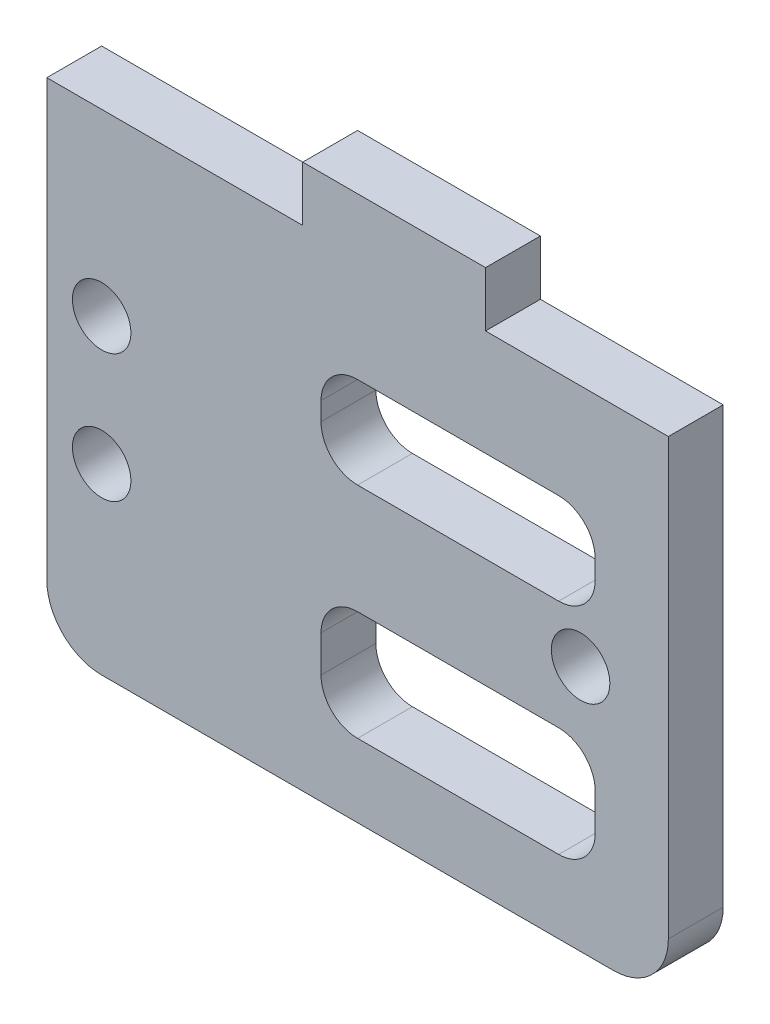
ISO-10303-21;
HEADER;
FILE_DESCRIPTION(('STEP AP214'),'2;1');
FILE_NAME('part.step','',(''),(''),'','','');
FILE_SCHEMA(('AUTOMOTIVE_DESIGN { 1 0 10303 214 1 1 1 1 }'));
ENDSEC;
DATA;
#1=APPLICATION_CONTEXT('core data for automotive mechanical design processes');
#2=APPLICATION_PROTOCOL_DEFINITION('international standard','automotive_design',2000,#1);
#3=PRODUCT_CONTEXT('',#1,'mechanical');
#4=PRODUCT('Part','Part','',(#3));
#5=PRODUCT_RELATED_PRODUCT_CATEGORY('part','',(#4));
#6=PRODUCT_DEFINITION_FORMATION('','',#4);
#7=PRODUCT_DEFINITION_CONTEXT('part definition',#1,'design');
#8=PRODUCT_DEFINITION('design','',#6,#7);
#9=PRODUCT_DEFINITION_SHAPE('','',#8);
#10=(LENGTH_UNIT() NAMED_UNIT(*) SI_UNIT(.MILLI.,.METRE.));
#11=(NAMED_UNIT(*) PLANE_ANGLE_UNIT() SI_UNIT($,.RADIAN.));
#12=(NAMED_UNIT(*) SI_UNIT($,.STERADIAN.) SOLID_ANGLE_UNIT());
#13=UNCERTAINTY_MEASURE_WITH_UNIT(LENGTH_MEASURE(1.E-05),#10,'distance_accuracy_value','');
#14=(GEOMETRIC_REPRESENTATION_CONTEXT(3) GLOBAL_UNCERTAINTY_ASSIGNED_CONTEXT((#13)) GLOBAL_UNIT_ASSIGNED_CONTEXT((#10,
#11,#12)) REPRESENTATION_CONTEXT('',''));
#15=CARTESIAN_POINT('',(0.,0.,0.));
#16=DIRECTION('',(0.,0.,1.));
#17=DIRECTION('',(1.,0.,0.));
#18=AXIS2_PLACEMENT_3D('',#15,#16,#17);
#19=CARTESIAN_POINT('',(0.,0.,3.));
#20=DIRECTION('',(0.,0.,-1.));
#21=DIRECTION('',(-1.,0.,0.));
#22=AXIS2_PLACEMENT_3D('',#19,#20,#21);
#23=PLANE('',#22);
#24=DIRECTION('',(0.,-1.,0.));
#25=VECTOR('',#24,1.);
#26=CARTESIAN_POINT('',(15.,10.,3.));
#27=LINE('',#26,#25);
#28=CARTESIAN_POINT('',(15.,8.,3.));
#29=VERTEX_POINT('',#28);
#30=CARTESIAN_POINT('',(15.,6.,3.));
#31=VERTEX_POINT('',#30);
#32=EDGE_CURVE('E475',#29,#31,#27,.T.);
#33=ORIENTED_EDGE('',*,*,#32,.F.);
#34=CARTESIAN_POINT('',(17.,8.,3.));
#35=DIRECTION('',(0.,0.,-1.));
#36=DIRECTION('',(-1.,0.,0.));
#37=AXIS2_PLACEMENT_3D('',#34,#35,#36);
#38=CIRCLE('',#37,2.);
#39=CARTESIAN_POINT('',(17.,10.,3.));
#40=VERTEX_POINT('',#39);
#41=EDGE_CURVE('E344',#29,#40,#38,.T.);
#42=ORIENTED_EDGE('',*,*,#41,.T.);
#43=DIRECTION('',(-1.,0.,0.));
#44=VECTOR('',#43,1.);
#45=CARTESIAN_POINT('',(15.,10.,3.));
#46=LINE('',#45,#44);
#47=CARTESIAN_POINT('',(28.,10.,3.));
#48=VERTEX_POINT('',#47);
#49=EDGE_CURVE('E464',#48,#40,#46,.T.);
#50=ORIENTED_EDGE('',*,*,#49,.F.);
#51=CARTESIAN_POINT('',(28.,8.,3.));
#52=DIRECTION('',(0.,0.,-1.));
#53=DIRECTION('',(-1.,0.,0.));
#54=AXIS2_PLACEMENT_3D('',#51,#52,#53);
#55=CIRCLE('',#54,2.);
#56=CARTESIAN_POINT('',(30.,8.,3.));
#57=VERTEX_POINT('',#56);
#58=EDGE_CURVE('E340',#48,#57,#55,.T.);
#59=ORIENTED_EDGE('',*,*,#58,.T.);
#60=DIRECTION('',(0.,1.,0.));
#61=VECTOR('',#60,1.);
#62=CARTESIAN_POINT('',(30.,10.,3.));
#63=LINE('',#62,#61);
#64=CARTESIAN_POINT('',(30.,6.,3.));
#65=VERTEX_POINT('',#64);
#66=EDGE_CURVE('E461',#65,#57,#63,.T.);
#67=ORIENTED_EDGE('',*,*,#66,.F.);
#68=CARTESIAN_POINT('',(28.,6.,3.));
#69=DIRECTION('',(0.,0.,-1.));
#70=DIRECTION('',(-1.,0.,0.));
#71=AXIS2_PLACEMENT_3D('',#68,#69,#70);
#72=CIRCLE('',#71,2.);
#73=CARTESIAN_POINT('',(28.,4.,3.));
#74=VERTEX_POINT('',#73);
#75=EDGE_CURVE('E336',#65,#74,#72,.T.);
#76=ORIENTED_EDGE('',*,*,#75,.T.);
#77=DIRECTION('',(1.,0.,0.));
#78=VECTOR('',#77,1.);
#79=CARTESIAN_POINT('',(15.,4.,3.));
#80=LINE('',#79,#78);
#81=CARTESIAN_POINT('',(17.,4.,3.));
#82=VERTEX_POINT('',#81);
#83=EDGE_CURVE('E470',#82,#74,#80,.T.);
#84=ORIENTED_EDGE('',*,*,#83,.F.);
#85=CARTESIAN_POINT('',(17.,6.,3.));
#86=DIRECTION('',(0.,0.,-1.));
#87=DIRECTION('',(-1.,0.,0.));
#88=AXIS2_PLACEMENT_3D('',#85,#86,#87);
#89=CIRCLE('',#88,2.);
#90=EDGE_CURVE('E332',#82,#31,#89,.T.);
#91=ORIENTED_EDGE('',*,*,#90,.T.);
#92=EDGE_LOOP('',(#33,#42,#50,#59,#67,#76,#84,#91));
#93=FACE_BOUND('',#92,.T.);
#94=DIRECTION('',(1.,0.,0.));
#95=VECTOR('',#94,1.);
#96=CARTESIAN_POINT('',(34.,0.,3.));
#97=LINE('',#96,#95);
#98=CARTESIAN_POINT('',(3.,0.,3.));
#99=VERTEX_POINT('',#98);
#100=CARTESIAN_POINT('',(31.,0.,3.));
#101=VERTEX_POINT('',#100);
#102=EDGE_CURVE('E218',#99,#101,#97,.T.);
#103=ORIENTED_EDGE('',*,*,#102,.T.);
#104=CARTESIAN_POINT('',(31.,3.,3.));
#105=DIRECTION('',(0.,0.,-1.));
#106=DIRECTION('',(-1.,0.,0.));
#107=AXIS2_PLACEMENT_3D('',#104,#105,#106);
#108=CIRCLE('',#107,3.);
#109=CARTESIAN_POINT('',(34.,3.,3.));
#110=VERTEX_POINT('',#109);
#111=EDGE_CURVE('E42',#101,#110,#108,.F.);
#112=ORIENTED_EDGE('',*,*,#111,.T.);
#113=DIRECTION('',(0.,1.,0.));
#114=VECTOR('',#113,1.);
#115=CARTESIAN_POINT('',(34.,26.8,3.));
#116=LINE('',#115,#114);
#117=CARTESIAN_POINT('',(34.,26.8,3.));
#118=VERTEX_POINT('',#117);
#119=EDGE_CURVE('E208',#110,#118,#116,.T.);
#120=ORIENTED_EDGE('',*,*,#119,.T.);
#121=DIRECTION('',(-1.,0.,0.));
#122=VECTOR('',#121,1.);
#123=CARTESIAN_POINT('',(24.,26.8,3.));
#124=LINE('',#123,#122);
#125=CARTESIAN_POINT('',(24.,26.8,3.));
#126=VERTEX_POINT('',#125);
#127=EDGE_CURVE('E212',#118,#126,#124,.T.);
#128=ORIENTED_EDGE('',*,*,#127,.T.);
#129=DIRECTION('',(0.,1.,0.));
#130=VECTOR('',#129,1.);
#131=CARTESIAN_POINT('',(24.,29.8,3.));
#132=LINE('',#131,#130);
#133=CARTESIAN_POINT('',(24.,29.8,3.));
#134=VERTEX_POINT('',#133);
#135=EDGE_CURVE('E233',#126,#134,#132,.T.);
#136=ORIENTED_EDGE('',*,*,#135,.T.);
#137=DIRECTION('',(-1.,0.,0.));
#138=VECTOR('',#137,1.);
#139=CARTESIAN_POINT('',(14.,29.8,3.));
#140=LINE('',#139,#138);
#141=CARTESIAN_POINT('',(14.,29.8,3.));
#142=VERTEX_POINT('',#141);
#143=EDGE_CURVE('E235',#134,#142,#140,.T.);
#144=ORIENTED_EDGE('',*,*,#143,.T.);
#145=DIRECTION('',(0.,-1.,0.));
#146=VECTOR('',#145,1.);
#147=CARTESIAN_POINT('',(14.,26.8,3.));
#148=LINE('',#147,#146);
#149=CARTESIAN_POINT('',(14.,26.8,3.));
#150=VERTEX_POINT('',#149);
#151=EDGE_CURVE('E240',#142,#150,#148,.T.);
#152=ORIENTED_EDGE('',*,*,#151,.T.);
#153=DIRECTION('',(-1.,0.,0.));
#154=VECTOR('',#153,1.);
#155=CARTESIAN_POINT('',(0.,26.8,3.));
#156=LINE('',#155,#154);
#157=CARTESIAN_POINT('',(0.,26.8,3.));
#158=VERTEX_POINT('',#157);
#159=EDGE_CURVE('E242',#150,#158,#156,.T.);
#160=ORIENTED_EDGE('',*,*,#159,.T.);
#161=DIRECTION('',(0.,-1.,0.));
#162=VECTOR('',#161,1.);
#163=CARTESIAN_POINT('',(0.,0.,3.));
#164=LINE('',#163,#162);
#165=CARTESIAN_POINT('',(0.,3.,3.));
#166=VERTEX_POINT('',#165);
#167=EDGE_CURVE('E244',#158,#166,#164,.T.);
#168=ORIENTED_EDGE('',*,*,#167,.T.);
#169=CARTESIAN_POINT('',(3.,3.,3.));
#170=DIRECTION('',(0.,0.,-1.));
#171=DIRECTION('',(-1.,0.,0.));
#172=AXIS2_PLACEMENT_3D('',#169,#170,#171);
#173=CIRCLE('',#172,3.);
#174=EDGE_CURVE('E356',#166,#99,#173,.F.);
#175=ORIENTED_EDGE('',*,*,#174,.T.);
#176=EDGE_LOOP('',(#103,#112,#120,#128,#136,#144,#152,#160,#168,#175));
#177=FACE_BOUND('',#176,.T.);
#178=CARTESIAN_POINT('',(3.,17.,3.));
#179=DIRECTION('',(0.,0.,1.));
#180=DIRECTION('',(1.,0.,0.));
#181=AXIS2_PLACEMENT_3D('',#178,#179,#180);
#182=CIRCLE('',#181,1.6);
#183=CARTESIAN_POINT('',(4.6,17.,3.));
#184=VERTEX_POINT('',#183);
#185=EDGE_CURVE('E249',#184,#184,#182,.T.);
#186=ORIENTED_EDGE('',*,*,#185,.F.);
#187=EDGE_LOOP('',(#186));
#188=FACE_BOUND('',#187,.T.);
#189=CARTESIAN_POINT('',(3.,10.,3.));
#190=DIRECTION('',(0.,0.,1.));
#191=DIRECTION('',(1.,0.,0.));
#192=AXIS2_PLACEMENT_3D('',#189,#190,#191);
#193=CIRCLE('',#192,1.6);
#194=CARTESIAN_POINT('',(4.6,10.,3.));
#195=VERTEX_POINT('',#194);
#196=EDGE_CURVE('E491',#195,#195,#193,.T.);
#197=ORIENTED_EDGE('',*,*,#196,.F.);
#198=EDGE_LOOP('',(#197));
#199=FACE_BOUND('',#198,.T.);
#200=DIRECTION('',(0.,-1.,0.));
#201=VECTOR('',#200,1.);
#202=CARTESIAN_POINT('',(15.,21.,3.));
#203=LINE('',#202,#201);
#204=CARTESIAN_POINT('',(15.,19.,3.));
#205=VERTEX_POINT('',#204);
#206=CARTESIAN_POINT('',(15.,18.,3.));
#207=VERTEX_POINT('',#206);
#208=EDGE_CURVE('E518',#205,#207,#203,.T.);
#209=ORIENTED_EDGE('',*,*,#208,.F.);
#210=CARTESIAN_POINT('',(17.,19.,3.));
#211=DIRECTION('',(0.,0.,-1.));
#212=DIRECTION('',(-1.,0.,0.));
#213=AXIS2_PLACEMENT_3D('',#210,#211,#212);
#214=CIRCLE('',#213,2.);
#215=CARTESIAN_POINT('',(17.,21.,3.));
#216=VERTEX_POINT('',#215);
#217=EDGE_CURVE('E324',#205,#216,#214,.T.);
#218=ORIENTED_EDGE('',*,*,#217,.T.);
#219=DIRECTION('',(-1.,0.,0.));
#220=VECTOR('',#219,1.);
#221=CARTESIAN_POINT('',(15.,21.,3.));
#222=LINE('',#221,#220);
#223=CARTESIAN_POINT('',(28.,21.,3.));
#224=VERTEX_POINT('',#223);
#225=EDGE_CURVE('E483',#224,#216,#222,.T.);
#226=ORIENTED_EDGE('',*,*,#225,.F.);
#227=CARTESIAN_POINT('',(28.,19.,3.));
#228=DIRECTION('',(0.,0.,-1.));
#229=DIRECTION('',(-1.,0.,0.));
#230=AXIS2_PLACEMENT_3D('',#227,#228,#229);
#231=CIRCLE('',#230,2.);
#232=CARTESIAN_POINT('',(30.,19.,3.));
#233=VERTEX_POINT('',#232);
#234=EDGE_CURVE('E320',#224,#233,#231,.T.);
#235=ORIENTED_EDGE('',*,*,#234,.T.);
#236=DIRECTION('',(0.,1.,0.));
#237=VECTOR('',#236,1.);
#238=CARTESIAN_POINT('',(30.,21.,3.));
#239=LINE('',#238,#237);
#240=CARTESIAN_POINT('',(30.,18.,3.));
#241=VERTEX_POINT('',#240);
#242=EDGE_CURVE('E538',#241,#233,#239,.T.);
#243=ORIENTED_EDGE('',*,*,#242,.F.);
#244=CARTESIAN_POINT('',(28.,18.,3.));
#245=DIRECTION('',(0.,0.,-1.));
#246=DIRECTION('',(-1.,0.,0.));
#247=AXIS2_PLACEMENT_3D('',#244,#245,#246);
#248=CIRCLE('',#247,2.);
#249=CARTESIAN_POINT('',(28.,16.,3.));
#250=VERTEX_POINT('',#249);
#251=EDGE_CURVE('E316',#241,#250,#248,.T.);
#252=ORIENTED_EDGE('',*,*,#251,.T.);
#253=DIRECTION('',(1.,0.,0.));
#254=VECTOR('',#253,1.);
#255=CARTESIAN_POINT('',(15.,16.,3.));
#256=LINE('',#255,#254);
#257=CARTESIAN_POINT('',(17.,16.,3.));
#258=VERTEX_POINT('',#257);
#259=EDGE_CURVE('E534',#258,#250,#256,.T.);
#260=ORIENTED_EDGE('',*,*,#259,.F.);
#261=CARTESIAN_POINT('',(17.,18.,3.));
#262=DIRECTION('',(0.,0.,-1.));
#263=DIRECTION('',(-1.,0.,0.));
#264=AXIS2_PLACEMENT_3D('',#261,#262,#263);
#265=CIRCLE('',#264,2.);
#266=EDGE_CURVE('E328',#258,#207,#265,.T.);
#267=ORIENTED_EDGE('',*,*,#266,.T.);
#268=EDGE_LOOP('',(#209,#218,#226,#235,#243,#252,#260,#267));
#269=FACE_BOUND('',#268,.T.);
#270=CARTESIAN_POINT('',(29.2,13.5,3.));
#271=DIRECTION('',(0.,0.,1.));
#272=DIRECTION('',(1.,0.,0.));
#273=AXIS2_PLACEMENT_3D('',#270,#271,#272);
#274=CIRCLE('',#273,1.6);
#275=CARTESIAN_POINT('',(30.8,13.5,3.));
#276=VERTEX_POINT('',#275);
#277=EDGE_CURVE('E522',#276,#276,#274,.T.);
#278=ORIENTED_EDGE('',*,*,#277,.F.);
#279=EDGE_LOOP('',(#278));
#280=FACE_BOUND('',#279,.T.);
#281=ADVANCED_FACE('F34',(#93,#177,#188,#199,#269,#280),#23,.F.);
#282=CARTESIAN_POINT('',(0.,0.,0.));
#283=DIRECTION('',(0.,0.,-1.));
#284=DIRECTION('',(-1.,0.,0.));
#285=AXIS2_PLACEMENT_3D('',#282,#283,#284);
#286=PLANE('',#285);
#287=DIRECTION('',(0.,1.,0.));
#288=VECTOR('',#287,1.);
#289=CARTESIAN_POINT('',(30.,21.,0.));
#290=LINE('',#289,#288);
#291=CARTESIAN_POINT('',(30.,18.,0.));
#292=VERTEX_POINT('',#291);
#293=CARTESIAN_POINT('',(30.,19.,0.));
#294=VERTEX_POINT('',#293);
#295=EDGE_CURVE('E545',#292,#294,#290,.T.);
#296=ORIENTED_EDGE('',*,*,#295,.T.);
#297=CARTESIAN_POINT('',(28.,19.,0.));
#298=DIRECTION('',(0.,0.,-1.));
#299=DIRECTION('',(-1.,0.,0.));
#300=AXIS2_PLACEMENT_3D('',#297,#298,#299);
#301=CIRCLE('',#300,2.);
#302=CARTESIAN_POINT('',(28.,21.,0.));
#303=VERTEX_POINT('',#302);
#304=EDGE_CURVE('E318',#294,#303,#301,.F.);
#305=ORIENTED_EDGE('',*,*,#304,.T.);
#306=DIRECTION('',(-1.,0.,0.));
#307=VECTOR('',#306,1.);
#308=CARTESIAN_POINT('',(15.,21.,0.));
#309=LINE('',#308,#307);
#310=CARTESIAN_POINT('',(17.,21.,0.));
#311=VERTEX_POINT('',#310);
#312=EDGE_CURVE('E535',#303,#311,#309,.T.);
#313=ORIENTED_EDGE('',*,*,#312,.T.);
#314=CARTESIAN_POINT('',(17.,19.,0.));
#315=DIRECTION('',(0.,0.,-1.));
#316=DIRECTION('',(-1.,0.,0.));
#317=AXIS2_PLACEMENT_3D('',#314,#315,#316);
#318=CIRCLE('',#317,2.);
#319=CARTESIAN_POINT('',(15.,19.,0.));
#320=VERTEX_POINT('',#319);
#321=EDGE_CURVE('E322',#311,#320,#318,.F.);
#322=ORIENTED_EDGE('',*,*,#321,.T.);
#323=DIRECTION('',(0.,-1.,0.));
#324=VECTOR('',#323,1.);
#325=CARTESIAN_POINT('',(15.,21.,0.));
#326=LINE('',#325,#324);
#327=CARTESIAN_POINT('',(15.,18.,0.));
#328=VERTEX_POINT('',#327);
#329=EDGE_CURVE('E524',#320,#328,#326,.T.);
#330=ORIENTED_EDGE('',*,*,#329,.T.);
#331=CARTESIAN_POINT('',(17.,18.,0.));
#332=DIRECTION('',(0.,0.,-1.));
#333=DIRECTION('',(-1.,0.,0.));
#334=AXIS2_PLACEMENT_3D('',#331,#332,#333);
#335=CIRCLE('',#334,2.);
#336=CARTESIAN_POINT('',(17.,16.,0.));
#337=VERTEX_POINT('',#336);
#338=EDGE_CURVE('E326',#328,#337,#335,.F.);
#339=ORIENTED_EDGE('',*,*,#338,.T.);
#340=DIRECTION('',(1.,0.,0.));
#341=VECTOR('',#340,1.);
#342=CARTESIAN_POINT('',(15.,16.,0.));
#343=LINE('',#342,#341);
#344=CARTESIAN_POINT('',(28.,16.,0.));
#345=VERTEX_POINT('',#344);
#346=EDGE_CURVE('E528',#337,#345,#343,.T.);
#347=ORIENTED_EDGE('',*,*,#346,.T.);
#348=CARTESIAN_POINT('',(28.,18.,0.));
#349=DIRECTION('',(0.,0.,-1.));
#350=DIRECTION('',(-1.,0.,0.));
#351=AXIS2_PLACEMENT_3D('',#348,#349,#350);
#352=CIRCLE('',#351,2.);
#353=EDGE_CURVE('E314',#345,#292,#352,.F.);
#354=ORIENTED_EDGE('',*,*,#353,.T.);
#355=EDGE_LOOP('',(#296,#305,#313,#322,#330,#339,#347,#354));
#356=FACE_BOUND('',#355,.T.);
#357=DIRECTION('',(0.,1.,0.));
#358=VECTOR('',#357,1.);
#359=CARTESIAN_POINT('',(30.,10.,0.));
#360=LINE('',#359,#358);
#361=CARTESIAN_POINT('',(30.,6.,0.));
#362=VERTEX_POINT('',#361);
#363=CARTESIAN_POINT('',(30.,8.,0.));
#364=VERTEX_POINT('',#363);
#365=EDGE_CURVE('E486',#362,#364,#360,.T.);
#366=ORIENTED_EDGE('',*,*,#365,.T.);
#367=CARTESIAN_POINT('',(28.,8.,0.));
#368=DIRECTION('',(0.,0.,-1.));
#369=DIRECTION('',(-1.,0.,0.));
#370=AXIS2_PLACEMENT_3D('',#367,#368,#369);
#371=CIRCLE('',#370,2.);
#372=CARTESIAN_POINT('',(28.,10.,0.));
#373=VERTEX_POINT('',#372);
#374=EDGE_CURVE('E338',#364,#373,#371,.F.);
#375=ORIENTED_EDGE('',*,*,#374,.T.);
#376=DIRECTION('',(-1.,0.,0.));
#377=VECTOR('',#376,1.);
#378=CARTESIAN_POINT('',(15.,10.,0.));
#379=LINE('',#378,#377);
#380=CARTESIAN_POINT('',(17.,10.,0.));
#381=VERTEX_POINT('',#380);
#382=EDGE_CURVE('E488',#373,#381,#379,.T.);
#383=ORIENTED_EDGE('',*,*,#382,.T.);
#384=CARTESIAN_POINT('',(17.,8.,0.));
#385=DIRECTION('',(0.,0.,-1.));
#386=DIRECTION('',(-1.,0.,0.));
#387=AXIS2_PLACEMENT_3D('',#384,#385,#386);
#388=CIRCLE('',#387,2.);
#389=CARTESIAN_POINT('',(15.,8.,0.));
#390=VERTEX_POINT('',#389);
#391=EDGE_CURVE('E342',#381,#390,#388,.F.);
#392=ORIENTED_EDGE('',*,*,#391,.T.);
#393=DIRECTION('',(0.,-1.,0.));
#394=VECTOR('',#393,1.);
#395=CARTESIAN_POINT('',(15.,10.,0.));
#396=LINE('',#395,#394);
#397=CARTESIAN_POINT('',(15.,6.,0.));
#398=VERTEX_POINT('',#397);
#399=EDGE_CURVE('E479',#390,#398,#396,.T.);
#400=ORIENTED_EDGE('',*,*,#399,.T.);
#401=CARTESIAN_POINT('',(17.,6.,0.));
#402=DIRECTION('',(0.,0.,-1.));
#403=DIRECTION('',(-1.,0.,0.));
#404=AXIS2_PLACEMENT_3D('',#401,#402,#403);
#405=CIRCLE('',#404,2.);
#406=CARTESIAN_POINT('',(17.,4.,0.));
#407=VERTEX_POINT('',#406);
#408=EDGE_CURVE('E330',#398,#407,#405,.F.);
#409=ORIENTED_EDGE('',*,*,#408,.T.);
#410=DIRECTION('',(1.,0.,0.));
#411=VECTOR('',#410,1.);
#412=CARTESIAN_POINT('',(15.,4.,0.));
#413=LINE('',#412,#411);
#414=CARTESIAN_POINT('',(28.,4.,0.));
#415=VERTEX_POINT('',#414);
#416=EDGE_CURVE('E482',#407,#415,#413,.T.);
#417=ORIENTED_EDGE('',*,*,#416,.T.);
#418=CARTESIAN_POINT('',(28.,6.,0.));
#419=DIRECTION('',(0.,0.,-1.));
#420=DIRECTION('',(-1.,0.,0.));
#421=AXIS2_PLACEMENT_3D('',#418,#419,#420);
#422=CIRCLE('',#421,2.);
#423=EDGE_CURVE('E334',#415,#362,#422,.F.);
#424=ORIENTED_EDGE('',*,*,#423,.T.);
#425=EDGE_LOOP('',(#366,#375,#383,#392,#400,#409,#417,#424));
#426=FACE_BOUND('',#425,.T.);
#427=CARTESIAN_POINT('',(3.,10.,0.));
#428=DIRECTION('',(0.,0.,1.));
#429=DIRECTION('',(1.,0.,0.));
#430=AXIS2_PLACEMENT_3D('',#427,#428,#429);
#431=CIRCLE('',#430,1.6);
#432=CARTESIAN_POINT('',(4.6,10.,0.));
#433=VERTEX_POINT('',#432);
#434=EDGE_CURVE('E472',#433,#433,#431,.T.);
#435=ORIENTED_EDGE('',*,*,#434,.T.);
#436=EDGE_LOOP('',(#435));
#437=FACE_BOUND('',#436,.T.);
#438=DIRECTION('',(0.,1.,0.));
#439=VECTOR('',#438,1.);
#440=CARTESIAN_POINT('',(34.,26.8,0.));
#441=LINE('',#440,#439);
#442=CARTESIAN_POINT('',(34.,3.,0.));
#443=VERTEX_POINT('',#442);
#444=CARTESIAN_POINT('',(34.,26.8,0.));
#445=VERTEX_POINT('',#444);
#446=EDGE_CURVE('E224',#443,#445,#441,.T.);
#447=ORIENTED_EDGE('',*,*,#446,.F.);
#448=CARTESIAN_POINT('',(31.,3.,0.));
#449=DIRECTION('',(0.,0.,-1.));
#450=DIRECTION('',(-1.,0.,0.));
#451=AXIS2_PLACEMENT_3D('',#448,#449,#450);
#452=CIRCLE('',#451,3.);
#453=CARTESIAN_POINT('',(31.,0.,0.));
#454=VERTEX_POINT('',#453);
#455=EDGE_CURVE('E350',#443,#454,#452,.T.);
#456=ORIENTED_EDGE('',*,*,#455,.T.);
#457=DIRECTION('',(1.,0.,0.));
#458=VECTOR('',#457,1.);
#459=CARTESIAN_POINT('',(34.,0.,0.));
#460=LINE('',#459,#458);
#461=CARTESIAN_POINT('',(3.,0.,0.));
#462=VERTEX_POINT('',#461);
#463=EDGE_CURVE('E247',#462,#454,#460,.T.);
#464=ORIENTED_EDGE('',*,*,#463,.F.);
#465=CARTESIAN_POINT('',(3.,3.,0.));
#466=DIRECTION('',(0.,0.,-1.));
#467=DIRECTION('',(-1.,0.,0.));
#468=AXIS2_PLACEMENT_3D('',#465,#466,#467);
#469=CIRCLE('',#468,3.);
#470=CARTESIAN_POINT('',(0.,3.,0.));
#471=VERTEX_POINT('',#470);
#472=EDGE_CURVE('E348',#462,#471,#469,.T.);
#473=ORIENTED_EDGE('',*,*,#472,.T.);
#474=DIRECTION('',(0.,-1.,0.));
#475=VECTOR('',#474,1.);
#476=CARTESIAN_POINT('',(0.,0.,0.));
#477=LINE('',#476,#475);
#478=CARTESIAN_POINT('',(0.,26.8,0.));
#479=VERTEX_POINT('',#478);
#480=EDGE_CURVE('E261',#479,#471,#477,.T.);
#481=ORIENTED_EDGE('',*,*,#480,.F.);
#482=DIRECTION('',(-1.,0.,0.));
#483=VECTOR('',#482,1.);
#484=CARTESIAN_POINT('',(0.,26.8,0.));
#485=LINE('',#484,#483);
#486=CARTESIAN_POINT('',(14.,26.8,0.));
#487=VERTEX_POINT('',#486);
#488=EDGE_CURVE('E259',#487,#479,#485,.T.);
#489=ORIENTED_EDGE('',*,*,#488,.F.);
#490=DIRECTION('',(0.,-1.,0.));
#491=VECTOR('',#490,1.);
#492=CARTESIAN_POINT('',(14.,26.8,0.));
#493=LINE('',#492,#491);
#494=CARTESIAN_POINT('',(14.,29.8,0.));
#495=VERTEX_POINT('',#494);
#496=EDGE_CURVE('E257',#495,#487,#493,.T.);
#497=ORIENTED_EDGE('',*,*,#496,.F.);
#498=DIRECTION('',(-1.,0.,0.));
#499=VECTOR('',#498,1.);
#500=CARTESIAN_POINT('',(14.,29.8,0.));
#501=LINE('',#500,#499);
#502=CARTESIAN_POINT('',(24.,29.8,0.));
#503=VERTEX_POINT('',#502);
#504=EDGE_CURVE('E255',#503,#495,#501,.T.);
#505=ORIENTED_EDGE('',*,*,#504,.F.);
#506=DIRECTION('',(0.,1.,0.));
#507=VECTOR('',#506,1.);
#508=CARTESIAN_POINT('',(24.,29.8,0.));
#509=LINE('',#508,#507);
#510=CARTESIAN_POINT('',(24.,26.8,0.));
#511=VERTEX_POINT('',#510);
#512=EDGE_CURVE('E253',#511,#503,#509,.T.);
#513=ORIENTED_EDGE('',*,*,#512,.F.);
#514=DIRECTION('',(-1.,0.,0.));
#515=VECTOR('',#514,1.);
#516=CARTESIAN_POINT('',(24.,26.8,0.));
#517=LINE('',#516,#515);
#518=EDGE_CURVE('E251',#445,#511,#517,.T.);
#519=ORIENTED_EDGE('',*,*,#518,.F.);
#520=EDGE_LOOP('',(#447,#456,#464,#473,#481,#489,#497,#505,#513,#519));
#521=FACE_BOUND('',#520,.T.);
#522=CARTESIAN_POINT('',(3.,17.,0.));
#523=DIRECTION('',(0.,0.,1.));
#524=DIRECTION('',(1.,0.,0.));
#525=AXIS2_PLACEMENT_3D('',#522,#523,#524);
#526=CIRCLE('',#525,1.6);
#527=CARTESIAN_POINT('',(4.6,17.,0.));
#528=VERTEX_POINT('',#527);
#529=EDGE_CURVE('E494',#528,#528,#526,.T.);
#530=ORIENTED_EDGE('',*,*,#529,.T.);
#531=EDGE_LOOP('',(#530));
#532=FACE_BOUND('',#531,.T.);
#533=CARTESIAN_POINT('',(29.2,13.5,0.));
#534=DIRECTION('',(0.,0.,1.));
#535=DIRECTION('',(1.,0.,0.));
#536=AXIS2_PLACEMENT_3D('',#533,#534,#535);
#537=CIRCLE('',#536,1.6);
#538=CARTESIAN_POINT('',(30.8,13.5,0.));
#539=VERTEX_POINT('',#538);
#540=EDGE_CURVE('E525',#539,#539,#537,.T.);
#541=ORIENTED_EDGE('',*,*,#540,.T.);
#542=EDGE_LOOP('',(#541));
#543=FACE_BOUND('',#542,.T.);
#544=ADVANCED_FACE('F364',(#356,#426,#437,#521,#532,#543),#286,.T.);
#545=CARTESIAN_POINT('',(34.,0.,3.));
#546=DIRECTION('',(0.,1.,0.));
#547=DIRECTION('',(0.,0.,1.));
#548=AXIS2_PLACEMENT_3D('',#545,#546,#547);
#549=PLANE('',#548);
#550=ORIENTED_EDGE('',*,*,#463,.T.);
#551=DIRECTION('',(0.,0.,-1.));
#552=VECTOR('',#551,1.);
#553=CARTESIAN_POINT('',(31.,0.,3.));
#554=LINE('',#553,#552);
#555=EDGE_CURVE('E55',#454,#101,#554,.F.);
#556=ORIENTED_EDGE('',*,*,#555,.T.);
#557=ORIENTED_EDGE('',*,*,#102,.F.);
#558=DIRECTION('',(0.,0.,-1.));
#559=VECTOR('',#558,1.);
#560=CARTESIAN_POINT('',(3.,0.,3.));
#561=LINE('',#560,#559);
#562=EDGE_CURVE('E352',#99,#462,#561,.T.);
#563=ORIENTED_EDGE('',*,*,#562,.T.);
#564=EDGE_LOOP('',(#550,#556,#557,#563));
#565=FACE_BOUND('',#564,.T.);
#566=ADVANCED_FACE('F360',(#565),#549,.F.);
#567=CARTESIAN_POINT('',(34.,26.8,3.));
#568=DIRECTION('',(-1.,0.,0.));
#569=DIRECTION('',(0.,0.,1.));
#570=AXIS2_PLACEMENT_3D('',#567,#568,#569);
#571=PLANE('',#570);
#572=ORIENTED_EDGE('',*,*,#119,.F.);
#573=DIRECTION('',(0.,0.,-1.));
#574=VECTOR('',#573,1.);
#575=CARTESIAN_POINT('',(34.,3.,3.));
#576=LINE('',#575,#574);
#577=EDGE_CURVE('E346',#110,#443,#576,.T.);
#578=ORIENTED_EDGE('',*,*,#577,.T.);
#579=ORIENTED_EDGE('',*,*,#446,.T.);
#580=DIRECTION('',(0.,0.,-1.));
#581=VECTOR('',#580,1.);
#582=CARTESIAN_POINT('',(34.,26.8,3.));
#583=LINE('',#582,#581);
#584=EDGE_CURVE('E221',#118,#445,#583,.T.);
#585=ORIENTED_EDGE('',*,*,#584,.F.);
#586=EDGE_LOOP('',(#572,#578,#579,#585));
#587=FACE_BOUND('',#586,.T.);
#588=ADVANCED_FACE('F222',(#587),#571,.F.);
#589=CARTESIAN_POINT('',(24.,26.8,3.));
#590=DIRECTION('',(0.,-1.,0.));
#591=DIRECTION('',(0.,0.,-1.));
#592=AXIS2_PLACEMENT_3D('',#589,#590,#591);
#593=PLANE('',#592);
#594=ORIENTED_EDGE('',*,*,#518,.T.);
#595=DIRECTION('',(0.,0.,-1.));
#596=VECTOR('',#595,1.);
#597=CARTESIAN_POINT('',(24.,26.8,3.));
#598=LINE('',#597,#596);
#599=EDGE_CURVE('E228',#126,#511,#598,.T.);
#600=ORIENTED_EDGE('',*,*,#599,.F.);
#601=ORIENTED_EDGE('',*,*,#127,.F.);
#602=ORIENTED_EDGE('',*,*,#584,.T.);
#603=EDGE_LOOP('',(#594,#600,#601,#602));
#604=FACE_BOUND('',#603,.T.);
#605=ADVANCED_FACE('F230',(#604),#593,.F.);
#606=CARTESIAN_POINT('',(24.,29.8,3.));
#607=DIRECTION('',(-1.,0.,0.));
#608=DIRECTION('',(0.,0.,1.));
#609=AXIS2_PLACEMENT_3D('',#606,#607,#608);
#610=PLANE('',#609);
#611=ORIENTED_EDGE('',*,*,#512,.T.);
#612=DIRECTION('',(0.,0.,-1.));
#613=VECTOR('',#612,1.);
#614=CARTESIAN_POINT('',(24.,29.8,3.));
#615=LINE('',#614,#613);
#616=EDGE_CURVE('E271',#134,#503,#615,.T.);
#617=ORIENTED_EDGE('',*,*,#616,.F.);
#618=ORIENTED_EDGE('',*,*,#135,.F.);
#619=ORIENTED_EDGE('',*,*,#599,.T.);
#620=EDGE_LOOP('',(#611,#617,#618,#619));
#621=FACE_BOUND('',#620,.T.);
#622=ADVANCED_FACE('F385',(#621),#610,.F.);
#623=CARTESIAN_POINT('',(14.,29.8,3.));
#624=DIRECTION('',(0.,-1.,0.));
#625=DIRECTION('',(1.,0.,0.));
#626=AXIS2_PLACEMENT_3D('',#623,#624,#625);
#627=PLANE('',#626);
#628=ORIENTED_EDGE('',*,*,#504,.T.);
#629=DIRECTION('',(0.,0.,-1.));
#630=VECTOR('',#629,1.);
#631=CARTESIAN_POINT('',(14.,29.8,3.));
#632=LINE('',#631,#630);
#633=EDGE_CURVE('E268',#142,#495,#632,.T.);
#634=ORIENTED_EDGE('',*,*,#633,.F.);
#635=ORIENTED_EDGE('',*,*,#143,.F.);
#636=ORIENTED_EDGE('',*,*,#616,.T.);
#637=EDGE_LOOP('',(#628,#634,#635,#636));
#638=FACE_BOUND('',#637,.T.);
#639=ADVANCED_FACE('F382',(#638),#627,.F.);
#640=CARTESIAN_POINT('',(14.,26.8,3.));
#641=DIRECTION('',(1.,0.,0.));
#642=DIRECTION('',(0.,0.,-1.));
#643=AXIS2_PLACEMENT_3D('',#640,#641,#642);
#644=PLANE('',#643);
#645=ORIENTED_EDGE('',*,*,#496,.T.);
#646=DIRECTION('',(0.,0.,-1.));
#647=VECTOR('',#646,1.);
#648=CARTESIAN_POINT('',(14.,26.8,3.));
#649=LINE('',#648,#647);
#650=EDGE_CURVE('E265',#150,#487,#649,.T.);
#651=ORIENTED_EDGE('',*,*,#650,.F.);
#652=ORIENTED_EDGE('',*,*,#151,.F.);
#653=ORIENTED_EDGE('',*,*,#633,.T.);
#654=EDGE_LOOP('',(#645,#651,#652,#653));
#655=FACE_BOUND('',#654,.T.);
#656=ADVANCED_FACE('F377',(#655),#644,.F.);
#657=CARTESIAN_POINT('',(0.,26.8,3.));
#658=DIRECTION('',(0.,-1.,0.));
#659=DIRECTION('',(0.,0.,-1.));
#660=AXIS2_PLACEMENT_3D('',#657,#658,#659);
#661=PLANE('',#660);
#662=ORIENTED_EDGE('',*,*,#488,.T.);
#663=DIRECTION('',(0.,0.,-1.));
#664=VECTOR('',#663,1.);
#665=CARTESIAN_POINT('',(0.,26.8,3.));
#666=LINE('',#665,#664);
#667=EDGE_CURVE('E246',#158,#479,#666,.T.);
#668=ORIENTED_EDGE('',*,*,#667,.F.);
#669=ORIENTED_EDGE('',*,*,#159,.F.);
#670=ORIENTED_EDGE('',*,*,#650,.T.);
#671=EDGE_LOOP('',(#662,#668,#669,#670));
#672=FACE_BOUND('',#671,.T.);
#673=ADVANCED_FACE('F371',(#672),#661,.F.);
#674=CARTESIAN_POINT('',(0.,0.,3.));
#675=DIRECTION('',(1.,0.,0.));
#676=DIRECTION('',(0.,0.,-1.));
#677=AXIS2_PLACEMENT_3D('',#674,#675,#676);
#678=PLANE('',#677);
#679=ORIENTED_EDGE('',*,*,#480,.T.);
#680=DIRECTION('',(0.,0.,-1.));
#681=VECTOR('',#680,1.);
#682=CARTESIAN_POINT('',(0.,3.,3.));
#683=LINE('',#682,#681);
#684=EDGE_CURVE('E11',#471,#166,#683,.F.);
#685=ORIENTED_EDGE('',*,*,#684,.T.);
#686=ORIENTED_EDGE('',*,*,#167,.F.);
#687=ORIENTED_EDGE('',*,*,#667,.T.);
#688=EDGE_LOOP('',(#679,#685,#686,#687));
#689=FACE_BOUND('',#688,.T.);
#690=ADVANCED_FACE('F367',(#689),#678,.F.);
#691=CARTESIAN_POINT('',(3.,17.,3.));
#692=DIRECTION('',(0.,0.,-1.));
#693=DIRECTION('',(-1.,0.,0.));
#694=AXIS2_PLACEMENT_3D('',#691,#692,#693);
#695=CYLINDRICAL_SURFACE('',#694,1.6);
#696=ORIENTED_EDGE('',*,*,#185,.T.);
#697=EDGE_LOOP('',(#696));
#698=FACE_BOUND('',#697,.T.);
#699=ORIENTED_EDGE('',*,*,#529,.F.);
#700=EDGE_LOOP('',(#699));
#701=FACE_BOUND('',#700,.T.);
#702=ADVANCED_FACE('F407',(#698,#701),#695,.F.);
#703=CARTESIAN_POINT('',(3.,10.,3.));
#704=DIRECTION('',(0.,0.,-1.));
#705=DIRECTION('',(-1.,0.,0.));
#706=AXIS2_PLACEMENT_3D('',#703,#704,#705);
#707=CYLINDRICAL_SURFACE('',#706,1.6);
#708=ORIENTED_EDGE('',*,*,#196,.T.);
#709=EDGE_LOOP('',(#708));
#710=FACE_BOUND('',#709,.T.);
#711=ORIENTED_EDGE('',*,*,#434,.F.);
#712=EDGE_LOOP('',(#711));
#713=FACE_BOUND('',#712,.T.);
#714=ADVANCED_FACE('F504',(#710,#713),#707,.F.);
#715=CARTESIAN_POINT('',(15.,10.,3.));
#716=DIRECTION('',(1.,0.,0.));
#717=DIRECTION('',(0.,0.,-1.));
#718=AXIS2_PLACEMENT_3D('',#715,#716,#717);
#719=PLANE('',#718);
#720=ORIENTED_EDGE('',*,*,#32,.T.);
#721=DIRECTION('',(0.,0.,-1.));
#722=VECTOR('',#721,1.);
#723=CARTESIAN_POINT('',(15.,6.,0.));
#724=LINE('',#723,#722);
#725=EDGE_CURVE('E296',#31,#398,#724,.T.);
#726=ORIENTED_EDGE('',*,*,#725,.T.);
#727=ORIENTED_EDGE('',*,*,#399,.F.);
#728=DIRECTION('',(0.,0.,-1.));
#729=VECTOR('',#728,1.);
#730=CARTESIAN_POINT('',(15.,8.,3.));
#731=LINE('',#730,#729);
#732=EDGE_CURVE('E294',#390,#29,#731,.F.);
#733=ORIENTED_EDGE('',*,*,#732,.T.);
#734=EDGE_LOOP('',(#720,#726,#727,#733));
#735=FACE_BOUND('',#734,.T.);
#736=ADVANCED_FACE('F509',(#735),#719,.T.);
#737=CARTESIAN_POINT('',(15.,4.,3.));
#738=DIRECTION('',(0.,1.,0.));
#739=DIRECTION('',(-1.,0.,0.));
#740=AXIS2_PLACEMENT_3D('',#737,#738,#739);
#741=PLANE('',#740);
#742=ORIENTED_EDGE('',*,*,#416,.F.);
#743=DIRECTION('',(0.,0.,-1.));
#744=VECTOR('',#743,1.);
#745=CARTESIAN_POINT('',(17.,4.,3.));
#746=LINE('',#745,#744);
#747=EDGE_CURVE('E302',#407,#82,#746,.F.);
#748=ORIENTED_EDGE('',*,*,#747,.T.);
#749=ORIENTED_EDGE('',*,*,#83,.T.);
#750=DIRECTION('',(0.,0.,-1.));
#751=VECTOR('',#750,1.);
#752=CARTESIAN_POINT('',(28.,4.,0.));
#753=LINE('',#752,#751);
#754=EDGE_CURVE('E299',#74,#415,#753,.T.);
#755=ORIENTED_EDGE('',*,*,#754,.T.);
#756=EDGE_LOOP('',(#742,#748,#749,#755));
#757=FACE_BOUND('',#756,.T.);
#758=ADVANCED_FACE('F561',(#757),#741,.T.);
#759=CARTESIAN_POINT('',(30.,10.,3.));
#760=DIRECTION('',(-1.,0.,0.));
#761=DIRECTION('',(0.,0.,1.));
#762=AXIS2_PLACEMENT_3D('',#759,#760,#761);
#763=PLANE('',#762);
#764=ORIENTED_EDGE('',*,*,#365,.F.);
#765=DIRECTION('',(0.,0.,-1.));
#766=VECTOR('',#765,1.);
#767=CARTESIAN_POINT('',(30.,6.,3.));
#768=LINE('',#767,#766);
#769=EDGE_CURVE('E307',#362,#65,#768,.F.);
#770=ORIENTED_EDGE('',*,*,#769,.T.);
#771=ORIENTED_EDGE('',*,*,#66,.T.);
#772=DIRECTION('',(0.,0.,-1.));
#773=VECTOR('',#772,1.);
#774=CARTESIAN_POINT('',(30.,8.,0.));
#775=LINE('',#774,#773);
#776=EDGE_CURVE('E304',#57,#364,#775,.T.);
#777=ORIENTED_EDGE('',*,*,#776,.T.);
#778=EDGE_LOOP('',(#764,#770,#771,#777));
#779=FACE_BOUND('',#778,.T.);
#780=ADVANCED_FACE('F467',(#779),#763,.T.);
#781=CARTESIAN_POINT('',(15.,10.,3.));
#782=DIRECTION('',(0.,-1.,0.));
#783=DIRECTION('',(0.,0.,-1.));
#784=AXIS2_PLACEMENT_3D('',#781,#782,#783);
#785=PLANE('',#784);
#786=ORIENTED_EDGE('',*,*,#382,.F.);
#787=DIRECTION('',(0.,0.,-1.));
#788=VECTOR('',#787,1.);
#789=CARTESIAN_POINT('',(28.,10.,3.));
#790=LINE('',#789,#788);
#791=EDGE_CURVE('E312',#373,#48,#790,.F.);
#792=ORIENTED_EDGE('',*,*,#791,.T.);
#793=ORIENTED_EDGE('',*,*,#49,.T.);
#794=DIRECTION('',(0.,0.,-1.));
#795=VECTOR('',#794,1.);
#796=CARTESIAN_POINT('',(17.,10.,0.));
#797=LINE('',#796,#795);
#798=EDGE_CURVE('E309',#40,#381,#797,.T.);
#799=ORIENTED_EDGE('',*,*,#798,.T.);
#800=EDGE_LOOP('',(#786,#792,#793,#799));
#801=FACE_BOUND('',#800,.T.);
#802=ADVANCED_FACE('F566',(#801),#785,.T.);
#803=CARTESIAN_POINT('',(15.,21.,3.));
#804=DIRECTION('',(1.,0.,0.));
#805=DIRECTION('',(0.,0.,-1.));
#806=AXIS2_PLACEMENT_3D('',#803,#804,#805);
#807=PLANE('',#806);
#808=ORIENTED_EDGE('',*,*,#329,.F.);
#809=DIRECTION('',(0.,0.,-1.));
#810=VECTOR('',#809,1.);
#811=CARTESIAN_POINT('',(15.,19.,3.));
#812=LINE('',#811,#810);
#813=EDGE_CURVE('E292',#320,#205,#812,.F.);
#814=ORIENTED_EDGE('',*,*,#813,.T.);
#815=ORIENTED_EDGE('',*,*,#208,.T.);
#816=DIRECTION('',(0.,0.,-1.));
#817=VECTOR('',#816,1.);
#818=CARTESIAN_POINT('',(15.,18.,0.));
#819=LINE('',#818,#817);
#820=EDGE_CURVE('E289',#207,#328,#819,.T.);
#821=ORIENTED_EDGE('',*,*,#820,.T.);
#822=EDGE_LOOP('',(#808,#814,#815,#821));
#823=FACE_BOUND('',#822,.T.);
#824=ADVANCED_FACE('F569',(#823),#807,.T.);
#825=CARTESIAN_POINT('',(15.,16.,3.));
#826=DIRECTION('',(0.,1.,0.));
#827=DIRECTION('',(0.,0.,1.));
#828=AXIS2_PLACEMENT_3D('',#825,#826,#827);
#829=PLANE('',#828);
#830=ORIENTED_EDGE('',*,*,#259,.T.);
#831=DIRECTION('',(0.,0.,-1.));
#832=VECTOR('',#831,1.);
#833=CARTESIAN_POINT('',(28.,16.,0.));
#834=LINE('',#833,#832);
#835=EDGE_CURVE('E276',#250,#345,#834,.T.);
#836=ORIENTED_EDGE('',*,*,#835,.T.);
#837=ORIENTED_EDGE('',*,*,#346,.F.);
#838=DIRECTION('',(0.,0.,-1.));
#839=VECTOR('',#838,1.);
#840=CARTESIAN_POINT('',(17.,16.,3.));
#841=LINE('',#840,#839);
#842=EDGE_CURVE('E227',#337,#258,#841,.F.);
#843=ORIENTED_EDGE('',*,*,#842,.T.);
#844=EDGE_LOOP('',(#830,#836,#837,#843));
#845=FACE_BOUND('',#844,.T.);
#846=ADVANCED_FACE('F575',(#845),#829,.T.);
#847=CARTESIAN_POINT('',(30.,21.,3.));
#848=DIRECTION('',(-1.,0.,0.));
#849=DIRECTION('',(0.,0.,1.));
#850=AXIS2_PLACEMENT_3D('',#847,#848,#849);
#851=PLANE('',#850);
#852=ORIENTED_EDGE('',*,*,#295,.F.);
#853=DIRECTION('',(0.,0.,-1.));
#854=VECTOR('',#853,1.);
#855=CARTESIAN_POINT('',(30.,18.,3.));
#856=LINE('',#855,#854);
#857=EDGE_CURVE('E282',#292,#241,#856,.F.);
#858=ORIENTED_EDGE('',*,*,#857,.T.);
#859=ORIENTED_EDGE('',*,*,#242,.T.);
#860=DIRECTION('',(0.,0.,-1.));
#861=VECTOR('',#860,1.);
#862=CARTESIAN_POINT('',(30.,19.,0.));
#863=LINE('',#862,#861);
#864=EDGE_CURVE('E279',#233,#294,#863,.T.);
#865=ORIENTED_EDGE('',*,*,#864,.T.);
#866=EDGE_LOOP('',(#852,#858,#859,#865));
#867=FACE_BOUND('',#866,.T.);
#868=ADVANCED_FACE('F616',(#867),#851,.T.);
#869=CARTESIAN_POINT('',(15.,21.,3.));
#870=DIRECTION('',(0.,-1.,0.));
#871=DIRECTION('',(0.,0.,-1.));
#872=AXIS2_PLACEMENT_3D('',#869,#870,#871);
#873=PLANE('',#872);
#874=ORIENTED_EDGE('',*,*,#312,.F.);
#875=DIRECTION('',(0.,0.,-1.));
#876=VECTOR('',#875,1.);
#877=CARTESIAN_POINT('',(28.,21.,3.));
#878=LINE('',#877,#876);
#879=EDGE_CURVE('E287',#303,#224,#878,.F.);
#880=ORIENTED_EDGE('',*,*,#879,.T.);
#881=ORIENTED_EDGE('',*,*,#225,.T.);
#882=DIRECTION('',(0.,0.,-1.));
#883=VECTOR('',#882,1.);
#884=CARTESIAN_POINT('',(17.,21.,0.));
#885=LINE('',#884,#883);
#886=EDGE_CURVE('E284',#216,#311,#885,.T.);
#887=ORIENTED_EDGE('',*,*,#886,.T.);
#888=EDGE_LOOP('',(#874,#880,#881,#887));
#889=FACE_BOUND('',#888,.T.);
#890=ADVANCED_FACE('F625',(#889),#873,.T.);
#891=CARTESIAN_POINT('',(29.2,13.5,3.));
#892=DIRECTION('',(0.,0.,-1.));
#893=DIRECTION('',(-1.,0.,0.));
#894=AXIS2_PLACEMENT_3D('',#891,#892,#893);
#895=CYLINDRICAL_SURFACE('',#894,1.6);
#896=ORIENTED_EDGE('',*,*,#277,.T.);
#897=EDGE_LOOP('',(#896));
#898=FACE_BOUND('',#897,.T.);
#899=ORIENTED_EDGE('',*,*,#540,.F.);
#900=EDGE_LOOP('',(#899));
#901=FACE_BOUND('',#900,.T.);
#902=ADVANCED_FACE('F430',(#898,#901),#895,.F.);
#903=CARTESIAN_POINT('',(28.,18.,3.));
#904=DIRECTION('',(0.,0.,1.));
#905=DIRECTION('',(1.,0.,0.));
#906=AXIS2_PLACEMENT_3D('',#903,#904,#905);
#907=CYLINDRICAL_SURFACE('',#906,2.);
#908=ORIENTED_EDGE('',*,*,#251,.F.);
#909=ORIENTED_EDGE('',*,*,#857,.F.);
#910=ORIENTED_EDGE('',*,*,#353,.F.);
#911=ORIENTED_EDGE('',*,*,#835,.F.);
#912=EDGE_LOOP('',(#908,#909,#910,#911));
#913=FACE_BOUND('',#912,.T.);
#914=ADVANCED_FACE('F426',(#913),#907,.F.);
#915=CARTESIAN_POINT('',(28.,19.,3.));
#916=DIRECTION('',(0.,0.,1.));
#917=DIRECTION('',(1.,0.,0.));
#918=AXIS2_PLACEMENT_3D('',#915,#916,#917);
#919=CYLINDRICAL_SURFACE('',#918,2.);
#920=ORIENTED_EDGE('',*,*,#234,.F.);
#921=ORIENTED_EDGE('',*,*,#879,.F.);
#922=ORIENTED_EDGE('',*,*,#304,.F.);
#923=ORIENTED_EDGE('',*,*,#864,.F.);
#924=EDGE_LOOP('',(#920,#921,#922,#923));
#925=FACE_BOUND('',#924,.T.);
#926=ADVANCED_FACE('F429',(#925),#919,.F.);
#927=CARTESIAN_POINT('',(17.,19.,3.));
#928=DIRECTION('',(0.,0.,1.));
#929=DIRECTION('',(1.,0.,0.));
#930=AXIS2_PLACEMENT_3D('',#927,#928,#929);
#931=CYLINDRICAL_SURFACE('',#930,2.);
#932=ORIENTED_EDGE('',*,*,#217,.F.);
#933=ORIENTED_EDGE('',*,*,#813,.F.);
#934=ORIENTED_EDGE('',*,*,#321,.F.);
#935=ORIENTED_EDGE('',*,*,#886,.F.);
#936=EDGE_LOOP('',(#932,#933,#934,#935));
#937=FACE_BOUND('',#936,.T.);
#938=ADVANCED_FACE('F434',(#937),#931,.F.);
#939=CARTESIAN_POINT('',(17.,18.,3.));
#940=DIRECTION('',(0.,0.,1.));
#941=DIRECTION('',(1.,0.,0.));
#942=AXIS2_PLACEMENT_3D('',#939,#940,#941);
#943=CYLINDRICAL_SURFACE('',#942,2.);
#944=ORIENTED_EDGE('',*,*,#266,.F.);
#945=ORIENTED_EDGE('',*,*,#842,.F.);
#946=ORIENTED_EDGE('',*,*,#338,.F.);
#947=ORIENTED_EDGE('',*,*,#820,.F.);
#948=EDGE_LOOP('',(#944,#945,#946,#947));
#949=FACE_BOUND('',#948,.T.);
#950=ADVANCED_FACE('F438',(#949),#943,.F.);
#951=CARTESIAN_POINT('',(17.,6.,3.));
#952=DIRECTION('',(0.,0.,1.));
#953=DIRECTION('',(1.,0.,0.));
#954=AXIS2_PLACEMENT_3D('',#951,#952,#953);
#955=CYLINDRICAL_SURFACE('',#954,2.);
#956=ORIENTED_EDGE('',*,*,#90,.F.);
#957=ORIENTED_EDGE('',*,*,#747,.F.);
#958=ORIENTED_EDGE('',*,*,#408,.F.);
#959=ORIENTED_EDGE('',*,*,#725,.F.);
#960=EDGE_LOOP('',(#956,#957,#958,#959));
#961=FACE_BOUND('',#960,.T.);
#962=ADVANCED_FACE('F442',(#961),#955,.F.);
#963=CARTESIAN_POINT('',(28.,6.,3.));
#964=DIRECTION('',(0.,0.,1.));
#965=DIRECTION('',(1.,0.,0.));
#966=AXIS2_PLACEMENT_3D('',#963,#964,#965);
#967=CYLINDRICAL_SURFACE('',#966,2.);
#968=ORIENTED_EDGE('',*,*,#75,.F.);
#969=ORIENTED_EDGE('',*,*,#769,.F.);
#970=ORIENTED_EDGE('',*,*,#423,.F.);
#971=ORIENTED_EDGE('',*,*,#754,.F.);
#972=EDGE_LOOP('',(#968,#969,#970,#971));
#973=FACE_BOUND('',#972,.T.);
#974=ADVANCED_FACE('F446',(#973),#967,.F.);
#975=CARTESIAN_POINT('',(28.,8.,3.));
#976=DIRECTION('',(0.,0.,1.));
#977=DIRECTION('',(1.,0.,0.));
#978=AXIS2_PLACEMENT_3D('',#975,#976,#977);
#979=CYLINDRICAL_SURFACE('',#978,2.);
#980=ORIENTED_EDGE('',*,*,#58,.F.);
#981=ORIENTED_EDGE('',*,*,#791,.F.);
#982=ORIENTED_EDGE('',*,*,#374,.F.);
#983=ORIENTED_EDGE('',*,*,#776,.F.);
#984=EDGE_LOOP('',(#980,#981,#982,#983));
#985=FACE_BOUND('',#984,.T.);
#986=ADVANCED_FACE('F394',(#985),#979,.F.);
#987=CARTESIAN_POINT('',(17.,8.,3.));
#988=DIRECTION('',(0.,0.,1.));
#989=DIRECTION('',(1.,0.,0.));
#990=AXIS2_PLACEMENT_3D('',#987,#988,#989);
#991=CYLINDRICAL_SURFACE('',#990,2.);
#992=ORIENTED_EDGE('',*,*,#41,.F.);
#993=ORIENTED_EDGE('',*,*,#732,.F.);
#994=ORIENTED_EDGE('',*,*,#391,.F.);
#995=ORIENTED_EDGE('',*,*,#798,.F.);
#996=EDGE_LOOP('',(#992,#993,#994,#995));
#997=FACE_BOUND('',#996,.T.);
#998=ADVANCED_FACE('F389',(#997),#991,.F.);
#999=CARTESIAN_POINT('',(31.,3.,3.));
#1000=DIRECTION('',(0.,0.,-1.));
#1001=DIRECTION('',(-1.,0.,0.));
#1002=AXIS2_PLACEMENT_3D('',#999,#1000,#1001);
#1003=CYLINDRICAL_SURFACE('',#1002,3.);
#1004=ORIENTED_EDGE('',*,*,#111,.F.);
#1005=ORIENTED_EDGE('',*,*,#555,.F.);
#1006=ORIENTED_EDGE('',*,*,#455,.F.);
#1007=ORIENTED_EDGE('',*,*,#577,.F.);
#1008=EDGE_LOOP('',(#1004,#1005,#1006,#1007));
#1009=FACE_BOUND('',#1008,.T.);
#1010=ADVANCED_FACE('F387',(#1009),#1003,.T.);
#1011=CARTESIAN_POINT('',(3.,3.,3.));
#1012=DIRECTION('',(0.,0.,-1.));
#1013=DIRECTION('',(-1.,0.,0.));
#1014=AXIS2_PLACEMENT_3D('',#1011,#1012,#1013);
#1015=CYLINDRICAL_SURFACE('',#1014,3.);
#1016=ORIENTED_EDGE('',*,*,#174,.F.);
#1017=ORIENTED_EDGE('',*,*,#684,.F.);
#1018=ORIENTED_EDGE('',*,*,#472,.F.);
#1019=ORIENTED_EDGE('',*,*,#562,.F.);
#1020=EDGE_LOOP('',(#1016,#1017,#1018,#1019));
#1021=FACE_BOUND('',#1020,.T.);
#1022=ADVANCED_FACE('F36',(#1021),#1015,.T.);
#1023=CLOSED_SHELL('',(#281,#544,#566,#588,#605,#622,#639,#656,#673,#690,#702,#714,#736,#758,
#780,#802,#824,#846,#868,#890,#902,#914,#926,#938,#950,#962,#974,#986,#998,#1010,#1022));
#1024=MANIFOLD_SOLID_BREP('B2',#1023);
#1025=ADVANCED_BREP_SHAPE_REPRESENTATION('',(#18,#1024),#14);
#1026=SHAPE_DEFINITION_REPRESENTATION(#9,#1025);
ENDSEC;
END-ISO-10303-21;
